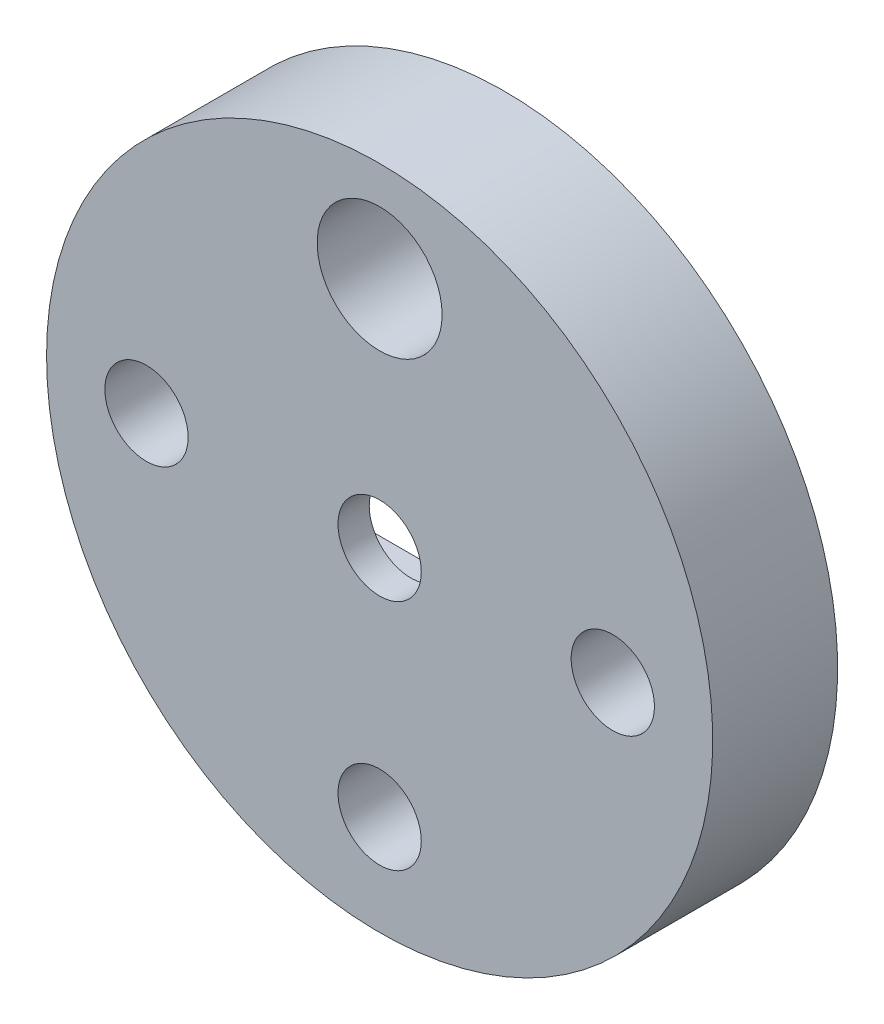
ISO-10303-21;
HEADER;
FILE_DESCRIPTION(('STEP AP214'),'2;1');
FILE_NAME('part.step','',(''),(''),'','','');
FILE_SCHEMA(('AUTOMOTIVE_DESIGN { 1 0 10303 214 1 1 1 1 }'));
ENDSEC;
DATA;
#1=APPLICATION_CONTEXT('core data for automotive mechanical design processes');
#2=APPLICATION_PROTOCOL_DEFINITION('international standard','automotive_design',2000,#1);
#3=PRODUCT_CONTEXT('',#1,'mechanical');
#4=PRODUCT('Part','Part','',(#3));
#5=PRODUCT_RELATED_PRODUCT_CATEGORY('part','',(#4));
#6=PRODUCT_DEFINITION_FORMATION('','',#4);
#7=PRODUCT_DEFINITION_CONTEXT('part definition',#1,'design');
#8=PRODUCT_DEFINITION('design','',#6,#7);
#9=PRODUCT_DEFINITION_SHAPE('','',#8);
#10=(LENGTH_UNIT() NAMED_UNIT(*) SI_UNIT(.MILLI.,.METRE.));
#11=(NAMED_UNIT(*) PLANE_ANGLE_UNIT() SI_UNIT($,.RADIAN.));
#12=(NAMED_UNIT(*) SI_UNIT($,.STERADIAN.) SOLID_ANGLE_UNIT());
#13=UNCERTAINTY_MEASURE_WITH_UNIT(LENGTH_MEASURE(1.E-05),#10,'distance_accuracy_value','');
#14=(GEOMETRIC_REPRESENTATION_CONTEXT(3) GLOBAL_UNCERTAINTY_ASSIGNED_CONTEXT((#13)) GLOBAL_UNIT_ASSIGNED_CONTEXT((#10,
#11,#12)) REPRESENTATION_CONTEXT('',''));
#15=CARTESIAN_POINT('',(0.,0.,0.));
#16=DIRECTION('',(0.,0.,1.));
#17=DIRECTION('',(1.,0.,0.));
#18=AXIS2_PLACEMENT_3D('',#15,#16,#17);
#19=CARTESIAN_POINT('',(0.,0.,0.));
#20=DIRECTION('',(0.,0.,1.));
#21=DIRECTION('',(1.,0.,0.));
#22=AXIS2_PLACEMENT_3D('',#19,#20,#21);
#23=PLANE('',#22);
#24=CARTESIAN_POINT('',(-17.78,0.,0.));
#25=DIRECTION('',(0.,0.,1.));
#26=DIRECTION('',(1.,0.,0.));
#27=AXIS2_PLACEMENT_3D('',#24,#25,#26);
#28=CIRCLE('',#27,3.175);
#29=CARTESIAN_POINT('',(-14.605,0.,0.));
#30=VERTEX_POINT('',#29);
#31=EDGE_CURVE('E174',#30,#30,#28,.T.);
#32=ORIENTED_EDGE('',*,*,#31,.T.);
#33=EDGE_LOOP('',(#32));
#34=FACE_BOUND('',#33,.T.);
#35=CARTESIAN_POINT('',(0.,17.78,0.));
#36=DIRECTION('',(0.,0.,1.));
#37=DIRECTION('',(1.,0.,0.));
#38=AXIS2_PLACEMENT_3D('',#35,#36,#37);
#39=CIRCLE('',#38,4.7625);
#40=CARTESIAN_POINT('',(4.7625,17.78,0.));
#41=VERTEX_POINT('',#40);
#42=EDGE_CURVE('E177',#41,#41,#39,.T.);
#43=ORIENTED_EDGE('',*,*,#42,.T.);
#44=EDGE_LOOP('',(#43));
#45=FACE_BOUND('',#44,.T.);
#46=CARTESIAN_POINT('',(17.78,0.,0.));
#47=DIRECTION('',(0.,0.,1.));
#48=DIRECTION('',(1.,0.,0.));
#49=AXIS2_PLACEMENT_3D('',#46,#47,#48);
#50=CIRCLE('',#49,3.175);
#51=CARTESIAN_POINT('',(20.955,0.,0.));
#52=VERTEX_POINT('',#51);
#53=EDGE_CURVE('E180',#52,#52,#50,.T.);
#54=ORIENTED_EDGE('',*,*,#53,.T.);
#55=EDGE_LOOP('',(#54));
#56=FACE_BOUND('',#55,.T.);
#57=CARTESIAN_POINT('',(0.,-17.7688972694278,0.));
#58=DIRECTION('',(0.,0.,1.));
#59=DIRECTION('',(1.,0.,0.));
#60=AXIS2_PLACEMENT_3D('',#57,#58,#59);
#61=CIRCLE('',#60,3.175);
#62=CARTESIAN_POINT('',(3.175,-17.7688972694278,0.));
#63=VERTEX_POINT('',#62);
#64=EDGE_CURVE('E168',#63,#63,#61,.T.);
#65=ORIENTED_EDGE('',*,*,#64,.T.);
#66=EDGE_LOOP('',(#65));
#67=FACE_BOUND('',#66,.T.);
#68=CARTESIAN_POINT('',(0.,0.,0.));
#69=DIRECTION('',(0.,0.,1.));
#70=DIRECTION('',(1.,0.,0.));
#71=AXIS2_PLACEMENT_3D('',#68,#69,#70);
#72=CIRCLE('',#71,25.4);
#73=CARTESIAN_POINT('',(-25.4,0.,0.));
#74=VERTEX_POINT('',#73);
#75=EDGE_CURVE('E37',#74,#74,#72,.T.);
#76=ORIENTED_EDGE('',*,*,#75,.F.);
#77=EDGE_LOOP('',(#76));
#78=FACE_BOUND('',#77,.T.);
#79=DIRECTION('',(0.,-1.,0.));
#80=VECTOR('',#79,1.);
#81=CARTESIAN_POINT('',(-10.31875,8.73125,0.));
#82=LINE('',#81,#80);
#83=CARTESIAN_POINT('',(-10.31875,8.73125,0.));
#84=VERTEX_POINT('',#83);
#85=CARTESIAN_POINT('',(-10.31875,-8.73125,0.));
#86=VERTEX_POINT('',#85);
#87=EDGE_CURVE('E48',#84,#86,#82,.T.);
#88=ORIENTED_EDGE('',*,*,#87,.T.);
#89=DIRECTION('',(1.,0.,0.));
#90=VECTOR('',#89,1.);
#91=CARTESIAN_POINT('',(-10.31875,-8.73125,0.));
#92=LINE('',#91,#90);
#93=CARTESIAN_POINT('',(10.31875,-8.73125,0.));
#94=VERTEX_POINT('',#93);
#95=EDGE_CURVE('E102',#86,#94,#92,.T.);
#96=ORIENTED_EDGE('',*,*,#95,.T.);
#97=DIRECTION('',(0.,-1.,0.));
#98=VECTOR('',#97,1.);
#99=CARTESIAN_POINT('',(10.31875,8.73125,0.));
#100=LINE('',#99,#98);
#101=CARTESIAN_POINT('',(10.31875,8.73125,0.));
#102=VERTEX_POINT('',#101);
#103=EDGE_CURVE('E91',#102,#94,#100,.T.);
#104=ORIENTED_EDGE('',*,*,#103,.F.);
#105=DIRECTION('',(1.,0.,0.));
#106=VECTOR('',#105,1.);
#107=CARTESIAN_POINT('',(-10.31875,8.73125,0.));
#108=LINE('',#107,#106);
#109=EDGE_CURVE('E106',#84,#102,#108,.T.);
#110=ORIENTED_EDGE('',*,*,#109,.F.);
#111=EDGE_LOOP('',(#88,#96,#104,#110));
#112=FACE_BOUND('',#111,.T.);
#113=ADVANCED_FACE('F33',(#34,#45,#56,#67,#78,#112),#23,.F.);
#114=CARTESIAN_POINT('',(0.,0.,9.525));
#115=DIRECTION('',(0.,0.,-1.));
#116=DIRECTION('',(-1.,0.,0.));
#117=AXIS2_PLACEMENT_3D('',#114,#115,#116);
#118=CYLINDRICAL_SURFACE('',#117,25.4);
#119=CARTESIAN_POINT('',(0.,0.,9.525));
#120=DIRECTION('',(0.,0.,1.));
#121=DIRECTION('',(1.,0.,0.));
#122=AXIS2_PLACEMENT_3D('',#119,#120,#121);
#123=CIRCLE('',#122,25.4);
#124=CARTESIAN_POINT('',(-25.4,0.,9.525));
#125=VERTEX_POINT('',#124);
#126=EDGE_CURVE('E11',#125,#125,#123,.T.);
#127=CARTESIAN_POINT('',(-25.4,0.,9.525));
#128=CARTESIAN_POINT('',(-25.4,0.,9.42578125));
#129=CARTESIAN_POINT('',(-25.4,0.,9.3265625));
#130=CARTESIAN_POINT('',(-25.4,0.,9.128125));
#131=CARTESIAN_POINT('',(-25.4,0.,9.02890625));
#132=CARTESIAN_POINT('',(-25.4,0.,8.83046875));
#133=CARTESIAN_POINT('',(-25.4,0.,8.73125));
#134=CARTESIAN_POINT('',(-25.4,0.,8.5328125));
#135=CARTESIAN_POINT('',(-25.4,0.,8.43359375));
#136=CARTESIAN_POINT('',(-25.4,0.,8.23515625));
#137=CARTESIAN_POINT('',(-25.4,0.,8.1359375));
#138=CARTESIAN_POINT('',(-25.4,0.,7.9375));
#139=CARTESIAN_POINT('',(-25.4,0.,7.83828125));
#140=CARTESIAN_POINT('',(-25.4,0.,7.63984375));
#141=CARTESIAN_POINT('',(-25.4,0.,7.540625));
#142=CARTESIAN_POINT('',(-25.4,0.,7.3421875));
#143=CARTESIAN_POINT('',(-25.4,0.,7.24296875));
#144=CARTESIAN_POINT('',(-25.4,0.,7.04453125));
#145=CARTESIAN_POINT('',(-25.4,0.,6.9453125));
#146=CARTESIAN_POINT('',(-25.4,0.,6.746875));
#147=CARTESIAN_POINT('',(-25.4,0.,6.64765625));
#148=CARTESIAN_POINT('',(-25.4,0.,6.44921875));
#149=CARTESIAN_POINT('',(-25.4,0.,6.35));
#150=CARTESIAN_POINT('',(-25.4,0.,6.1515625));
#151=CARTESIAN_POINT('',(-25.4,0.,6.05234375));
#152=CARTESIAN_POINT('',(-25.4,0.,5.85390625));
#153=CARTESIAN_POINT('',(-25.4,0.,5.7546875));
#154=CARTESIAN_POINT('',(-25.4,0.,5.55625));
#155=CARTESIAN_POINT('',(-25.4,0.,5.45703125));
#156=CARTESIAN_POINT('',(-25.4,0.,5.25859375));
#157=CARTESIAN_POINT('',(-25.4,0.,5.159375));
#158=CARTESIAN_POINT('',(-25.4,0.,4.9609375));
#159=CARTESIAN_POINT('',(-25.4,0.,4.86171875));
#160=CARTESIAN_POINT('',(-25.4,0.,4.66328125));
#161=CARTESIAN_POINT('',(-25.4,0.,4.5640625));
#162=CARTESIAN_POINT('',(-25.4,0.,4.365625));
#163=CARTESIAN_POINT('',(-25.4,0.,4.26640625));
#164=CARTESIAN_POINT('',(-25.4,0.,4.06796875));
#165=CARTESIAN_POINT('',(-25.4,0.,3.96875));
#166=CARTESIAN_POINT('',(-25.4,0.,3.7703125));
#167=CARTESIAN_POINT('',(-25.4,0.,3.67109375));
#168=CARTESIAN_POINT('',(-25.4,0.,3.47265625));
#169=CARTESIAN_POINT('',(-25.4,0.,3.3734375));
#170=CARTESIAN_POINT('',(-25.4,0.,3.175));
#171=CARTESIAN_POINT('',(-25.4,0.,3.07578125));
#172=CARTESIAN_POINT('',(-25.4,0.,2.87734375));
#173=CARTESIAN_POINT('',(-25.4,0.,2.778125));
#174=CARTESIAN_POINT('',(-25.4,0.,2.5796875));
#175=CARTESIAN_POINT('',(-25.4,0.,2.48046875));
#176=CARTESIAN_POINT('',(-25.4,0.,2.28203125));
#177=CARTESIAN_POINT('',(-25.4,0.,2.1828125));
#178=CARTESIAN_POINT('',(-25.4,0.,1.984375));
#179=CARTESIAN_POINT('',(-25.4,0.,1.88515625));
#180=CARTESIAN_POINT('',(-25.4,0.,1.68671875));
#181=CARTESIAN_POINT('',(-25.4,0.,1.5875));
#182=CARTESIAN_POINT('',(-25.4,0.,1.3890625));
#183=CARTESIAN_POINT('',(-25.4,0.,1.28984375));
#184=CARTESIAN_POINT('',(-25.4,0.,1.09140625));
#185=CARTESIAN_POINT('',(-25.4,0.,0.992187500000001));
#186=CARTESIAN_POINT('',(-25.4,0.,0.793750000000001));
#187=CARTESIAN_POINT('',(-25.4,0.,0.69453125));
#188=CARTESIAN_POINT('',(-25.4,0.,0.49609375));
#189=CARTESIAN_POINT('',(-25.4,0.,0.396875));
#190=CARTESIAN_POINT('',(-25.4,0.,0.1984375));
#191=CARTESIAN_POINT('',(-25.4,0.,0.0992187500000001));
#192=CARTESIAN_POINT('',(-25.4,0.,0.));
#193=B_SPLINE_CURVE_WITH_KNOTS('',3,(#127,#128,#129,#130,#131,#132,#133,#134,#135,#136,#137,
#138,#139,#140,#141,#142,#143,#144,#145,#146,#147,#148,#149,#150,#151,#152,#153,#154,#155,#156,
#157,#158,#159,#160,#161,#162,#163,#164,#165,#166,#167,#168,#169,#170,#171,#172,#173,#174,#175,
#176,#177,#178,#179,#180,#181,#182,#183,#184,#185,#186,#187,#188,#189,#190,#191,#192),
.UNSPECIFIED.,.F.,.F.,(4,2,2,2,2,2,2,2,2,2,2,2,2,2,2,2,2,2,2,2,2,2,2,2,2,2,2,2,2,2,2,2,4),(0.,
0.297656249999998,0.595312499999999,0.892968749999999,1.190625,1.48828125,1.7859375,2.08359375,
2.38125,2.67890625,2.9765625,3.27421875,3.571875,3.86953125,4.1671875,4.46484375,4.7625,
5.06015625,5.3578125,5.65546875,5.953125,6.25078125,6.5484375,6.84609375,7.14375,7.44140625,
7.7390625,8.03671875,8.334375,8.63203125,8.9296875,9.22734375,9.525),.UNSPECIFIED.);
#194=EDGE_CURVE('BSEAM35',#125,#74,#193,.T.);
#195=ORIENTED_EDGE('',*,*,#126,.F.);
#196=ORIENTED_EDGE('',*,*,#75,.T.);
#197=ORIENTED_EDGE('',*,*,#194,.T.);
#198=ORIENTED_EDGE('',*,*,#194,.F.);
#199=EDGE_LOOP('',(#195,#197,#196,#198));
#200=FACE_BOUND('',#199,.T.);
#201=ADVANCED_FACE('F35',(#200),#118,.T.);
#202=CARTESIAN_POINT('',(0.,0.,9.525));
#203=DIRECTION('',(0.,0.,1.));
#204=DIRECTION('',(1.,0.,0.));
#205=AXIS2_PLACEMENT_3D('',#202,#203,#204);
#206=PLANE('',#205);
#207=CARTESIAN_POINT('',(-17.78,0.,9.525));
#208=DIRECTION('',(0.,0.,1.));
#209=DIRECTION('',(1.,0.,0.));
#210=AXIS2_PLACEMENT_3D('',#207,#208,#209);
#211=CIRCLE('',#210,3.175);
#212=CARTESIAN_POINT('',(-14.605,0.,9.525));
#213=VERTEX_POINT('',#212);
#214=EDGE_CURVE('E147',#213,#213,#211,.T.);
#215=ORIENTED_EDGE('',*,*,#214,.F.);
#216=EDGE_LOOP('',(#215));
#217=FACE_BOUND('',#216,.T.);
#218=CARTESIAN_POINT('',(0.,17.78,9.525));
#219=DIRECTION('',(0.,0.,1.));
#220=DIRECTION('',(1.,0.,0.));
#221=AXIS2_PLACEMENT_3D('',#218,#219,#220);
#222=CIRCLE('',#221,4.7625);
#223=CARTESIAN_POINT('',(4.7625,17.78,9.525));
#224=VERTEX_POINT('',#223);
#225=EDGE_CURVE('E151',#224,#224,#222,.T.);
#226=ORIENTED_EDGE('',*,*,#225,.F.);
#227=EDGE_LOOP('',(#226));
#228=FACE_BOUND('',#227,.T.);
#229=CARTESIAN_POINT('',(17.78,0.,9.525));
#230=DIRECTION('',(0.,0.,1.));
#231=DIRECTION('',(1.,0.,0.));
#232=AXIS2_PLACEMENT_3D('',#229,#230,#231);
#233=CIRCLE('',#232,3.175);
#234=CARTESIAN_POINT('',(20.955,0.,9.525));
#235=VERTEX_POINT('',#234);
#236=EDGE_CURVE('E155',#235,#235,#233,.T.);
#237=ORIENTED_EDGE('',*,*,#236,.F.);
#238=EDGE_LOOP('',(#237));
#239=FACE_BOUND('',#238,.T.);
#240=CARTESIAN_POINT('',(0.,-17.7688972694278,9.525));
#241=DIRECTION('',(0.,0.,1.));
#242=DIRECTION('',(1.,0.,0.));
#243=AXIS2_PLACEMENT_3D('',#240,#241,#242);
#244=CIRCLE('',#243,3.175);
#245=CARTESIAN_POINT('',(3.175,-17.7688972694278,9.525));
#246=VERTEX_POINT('',#245);
#247=EDGE_CURVE('E159',#246,#246,#244,.T.);
#248=ORIENTED_EDGE('',*,*,#247,.F.);
#249=EDGE_LOOP('',(#248));
#250=FACE_BOUND('',#249,.T.);
#251=CARTESIAN_POINT('',(0.,0.,9.525));
#252=DIRECTION('',(0.,0.,1.));
#253=DIRECTION('',(1.,0.,0.));
#254=AXIS2_PLACEMENT_3D('',#251,#252,#253);
#255=CIRCLE('',#254,3.175);
#256=CARTESIAN_POINT('',(3.175,0.,9.525));
#257=VERTEX_POINT('',#256);
#258=EDGE_CURVE('E103',#257,#257,#255,.T.);
#259=ORIENTED_EDGE('',*,*,#258,.F.);
#260=EDGE_LOOP('',(#259));
#261=FACE_BOUND('',#260,.T.);
#262=ORIENTED_EDGE('',*,*,#126,.T.);
#263=EDGE_LOOP('',(#262));
#264=FACE_BOUND('',#263,.T.);
#265=ADVANCED_FACE('F137',(#217,#228,#239,#250,#261,#264),#206,.T.);
#266=CARTESIAN_POINT('',(-10.31875,8.73125,7.14375));
#267=DIRECTION('',(1.,0.,0.));
#268=DIRECTION('',(0.,1.,0.));
#269=AXIS2_PLACEMENT_3D('',#266,#267,#268);
#270=PLANE('',#269);
#271=ORIENTED_EDGE('',*,*,#87,.F.);
#272=DIRECTION('',(0.,0.,-1.));
#273=VECTOR('',#272,1.);
#274=CARTESIAN_POINT('',(-10.31875,8.73125,7.14375));
#275=LINE('',#274,#273);
#276=CARTESIAN_POINT('',(-10.31875,8.73125,7.14375));
#277=VERTEX_POINT('',#276);
#278=EDGE_CURVE('E53',#277,#84,#275,.T.);
#279=ORIENTED_EDGE('',*,*,#278,.F.);
#280=DIRECTION('',(0.,-1.,0.));
#281=VECTOR('',#280,1.);
#282=CARTESIAN_POINT('',(-10.31875,8.73125,7.14375));
#283=LINE('',#282,#281);
#284=CARTESIAN_POINT('',(-10.31875,-8.73125,7.14375));
#285=VERTEX_POINT('',#284);
#286=EDGE_CURVE('E86',#277,#285,#283,.T.);
#287=ORIENTED_EDGE('',*,*,#286,.T.);
#288=DIRECTION('',(0.,0.,-1.));
#289=VECTOR('',#288,1.);
#290=CARTESIAN_POINT('',(-10.31875,-8.73125,7.14375));
#291=LINE('',#290,#289);
#292=EDGE_CURVE('E84',#285,#86,#291,.T.);
#293=ORIENTED_EDGE('',*,*,#292,.T.);
#294=EDGE_LOOP('',(#271,#279,#287,#293));
#295=FACE_BOUND('',#294,.T.);
#296=ADVANCED_FACE('F134',(#295),#270,.T.);
#297=CARTESIAN_POINT('',(-10.31875,-8.73125,7.14375));
#298=DIRECTION('',(0.,1.,0.));
#299=DIRECTION('',(0.,0.,1.));
#300=AXIS2_PLACEMENT_3D('',#297,#298,#299);
#301=PLANE('',#300);
#302=ORIENTED_EDGE('',*,*,#95,.F.);
#303=ORIENTED_EDGE('',*,*,#292,.F.);
#304=DIRECTION('',(1.,0.,0.));
#305=VECTOR('',#304,1.);
#306=CARTESIAN_POINT('',(-10.31875,-8.73125,7.14375));
#307=LINE('',#306,#305);
#308=CARTESIAN_POINT('',(10.31875,-8.73125,7.14375));
#309=VERTEX_POINT('',#308);
#310=EDGE_CURVE('E78',#285,#309,#307,.T.);
#311=ORIENTED_EDGE('',*,*,#310,.T.);
#312=DIRECTION('',(0.,0.,-1.));
#313=VECTOR('',#312,1.);
#314=CARTESIAN_POINT('',(10.31875,-8.73125,7.14375));
#315=LINE('',#314,#313);
#316=EDGE_CURVE('E83',#309,#94,#315,.T.);
#317=ORIENTED_EDGE('',*,*,#316,.T.);
#318=EDGE_LOOP('',(#302,#303,#311,#317));
#319=FACE_BOUND('',#318,.T.);
#320=ADVANCED_FACE('F82',(#319),#301,.T.);
#321=CARTESIAN_POINT('',(10.31875,8.73125,7.14375));
#322=DIRECTION('',(1.,0.,0.));
#323=DIRECTION('',(0.,1.,0.));
#324=AXIS2_PLACEMENT_3D('',#321,#322,#323);
#325=PLANE('',#324);
#326=ORIENTED_EDGE('',*,*,#103,.T.);
#327=ORIENTED_EDGE('',*,*,#316,.F.);
#328=DIRECTION('',(0.,-1.,0.));
#329=VECTOR('',#328,1.);
#330=CARTESIAN_POINT('',(10.31875,8.73125,7.14375));
#331=LINE('',#330,#329);
#332=CARTESIAN_POINT('',(10.31875,8.73125,7.14375));
#333=VERTEX_POINT('',#332);
#334=EDGE_CURVE('E85',#333,#309,#331,.T.);
#335=ORIENTED_EDGE('',*,*,#334,.F.);
#336=DIRECTION('',(0.,0.,-1.));
#337=VECTOR('',#336,1.);
#338=CARTESIAN_POINT('',(10.31875,8.73125,7.14375));
#339=LINE('',#338,#337);
#340=EDGE_CURVE('E71',#333,#102,#339,.T.);
#341=ORIENTED_EDGE('',*,*,#340,.T.);
#342=EDGE_LOOP('',(#326,#327,#335,#341));
#343=FACE_BOUND('',#342,.T.);
#344=ADVANCED_FACE('F88',(#343),#325,.F.);
#345=CARTESIAN_POINT('',(-10.31875,8.73125,7.14375));
#346=DIRECTION('',(0.,1.,0.));
#347=DIRECTION('',(0.,0.,1.));
#348=AXIS2_PLACEMENT_3D('',#345,#346,#347);
#349=PLANE('',#348);
#350=ORIENTED_EDGE('',*,*,#109,.T.);
#351=ORIENTED_EDGE('',*,*,#340,.F.);
#352=DIRECTION('',(1.,0.,0.));
#353=VECTOR('',#352,1.);
#354=CARTESIAN_POINT('',(-10.31875,8.73125,7.14375));
#355=LINE('',#354,#353);
#356=EDGE_CURVE('E96',#277,#333,#355,.T.);
#357=ORIENTED_EDGE('',*,*,#356,.F.);
#358=ORIENTED_EDGE('',*,*,#278,.T.);
#359=EDGE_LOOP('',(#350,#351,#357,#358));
#360=FACE_BOUND('',#359,.T.);
#361=ADVANCED_FACE('F119',(#360),#349,.F.);
#362=CARTESIAN_POINT('',(0.,0.,7.14375));
#363=DIRECTION('',(0.,0.,1.));
#364=DIRECTION('',(1.,0.,0.));
#365=AXIS2_PLACEMENT_3D('',#362,#363,#364);
#366=PLANE('',#365);
#367=CARTESIAN_POINT('',(0.,0.,7.14375));
#368=DIRECTION('',(0.,0.,-1.));
#369=DIRECTION('',(-1.,0.,0.));
#370=AXIS2_PLACEMENT_3D('',#367,#368,#369);
#371=CIRCLE('',#370,3.175);
#372=CARTESIAN_POINT('',(-3.175,0.,7.14375));
#373=VERTEX_POINT('',#372);
#374=EDGE_CURVE('E165',#373,#373,#371,.T.);
#375=ORIENTED_EDGE('',*,*,#374,.F.);
#376=EDGE_LOOP('',(#375));
#377=FACE_BOUND('',#376,.T.);
#378=ORIENTED_EDGE('',*,*,#286,.F.);
#379=ORIENTED_EDGE('',*,*,#356,.T.);
#380=ORIENTED_EDGE('',*,*,#334,.T.);
#381=ORIENTED_EDGE('',*,*,#310,.F.);
#382=EDGE_LOOP('',(#378,#379,#380,#381));
#383=FACE_BOUND('',#382,.T.);
#384=ADVANCED_FACE('F94',(#377,#383),#366,.F.);
#385=CARTESIAN_POINT('',(0.,0.,22.70125));
#386=DIRECTION('',(0.,0.,-1.));
#387=DIRECTION('',(-1.,0.,0.));
#388=AXIS2_PLACEMENT_3D('',#385,#386,#387);
#389=CYLINDRICAL_SURFACE('',#388,3.175);
#390=ORIENTED_EDGE('',*,*,#258,.T.);
#391=EDGE_LOOP('',(#390));
#392=FACE_BOUND('',#391,.T.);
#393=ORIENTED_EDGE('',*,*,#374,.T.);
#394=EDGE_LOOP('',(#393));
#395=FACE_BOUND('',#394,.T.);
#396=ADVANCED_FACE('F126',(#392,#395),#389,.F.);
#397=CARTESIAN_POINT('',(0.,-17.7688972694278,-6.0325));
#398=DIRECTION('',(0.,0.,1.));
#399=DIRECTION('',(1.,0.,0.));
#400=AXIS2_PLACEMENT_3D('',#397,#398,#399);
#401=CYLINDRICAL_SURFACE('',#400,3.175);
#402=ORIENTED_EDGE('',*,*,#247,.T.);
#403=EDGE_LOOP('',(#402));
#404=FACE_BOUND('',#403,.T.);
#405=ORIENTED_EDGE('',*,*,#64,.F.);
#406=EDGE_LOOP('',(#405));
#407=FACE_BOUND('',#406,.T.);
#408=ADVANCED_FACE('F199',(#404,#407),#401,.F.);
#409=CARTESIAN_POINT('',(17.78,0.,-6.0325));
#410=DIRECTION('',(0.,0.,1.));
#411=DIRECTION('',(1.,0.,0.));
#412=AXIS2_PLACEMENT_3D('',#409,#410,#411);
#413=CYLINDRICAL_SURFACE('',#412,3.175);
#414=ORIENTED_EDGE('',*,*,#236,.T.);
#415=EDGE_LOOP('',(#414));
#416=FACE_BOUND('',#415,.T.);
#417=ORIENTED_EDGE('',*,*,#53,.F.);
#418=EDGE_LOOP('',(#417));
#419=FACE_BOUND('',#418,.T.);
#420=ADVANCED_FACE('F201',(#416,#419),#413,.F.);
#421=CARTESIAN_POINT('',(0.,17.78,-6.0325));
#422=DIRECTION('',(0.,0.,1.));
#423=DIRECTION('',(1.,0.,0.));
#424=AXIS2_PLACEMENT_3D('',#421,#422,#423);
#425=CYLINDRICAL_SURFACE('',#424,4.7625);
#426=ORIENTED_EDGE('',*,*,#225,.T.);
#427=EDGE_LOOP('',(#426));
#428=FACE_BOUND('',#427,.T.);
#429=ORIENTED_EDGE('',*,*,#42,.F.);
#430=EDGE_LOOP('',(#429));
#431=FACE_BOUND('',#430,.T.);
#432=ADVANCED_FACE('F189',(#428,#431),#425,.F.);
#433=CARTESIAN_POINT('',(-17.78,0.,-6.0325));
#434=DIRECTION('',(0.,0.,1.));
#435=DIRECTION('',(1.,0.,0.));
#436=AXIS2_PLACEMENT_3D('',#433,#434,#435);
#437=CYLINDRICAL_SURFACE('',#436,3.175);
#438=ORIENTED_EDGE('',*,*,#214,.T.);
#439=EDGE_LOOP('',(#438));
#440=FACE_BOUND('',#439,.T.);
#441=ORIENTED_EDGE('',*,*,#31,.F.);
#442=EDGE_LOOP('',(#441));
#443=FACE_BOUND('',#442,.T.);
#444=ADVANCED_FACE('F186',(#440,#443),#437,.F.);
#445=CLOSED_SHELL('',(#113,#201,#265,#296,#320,#344,#361,#384,#396,#408,#420,#432,#444));
#446=MANIFOLD_SOLID_BREP('B2',#445);
#447=ADVANCED_BREP_SHAPE_REPRESENTATION('',(#18,#446),#14);
#448=SHAPE_DEFINITION_REPRESENTATION(#9,#447);
ENDSEC;
END-ISO-10303-21;
